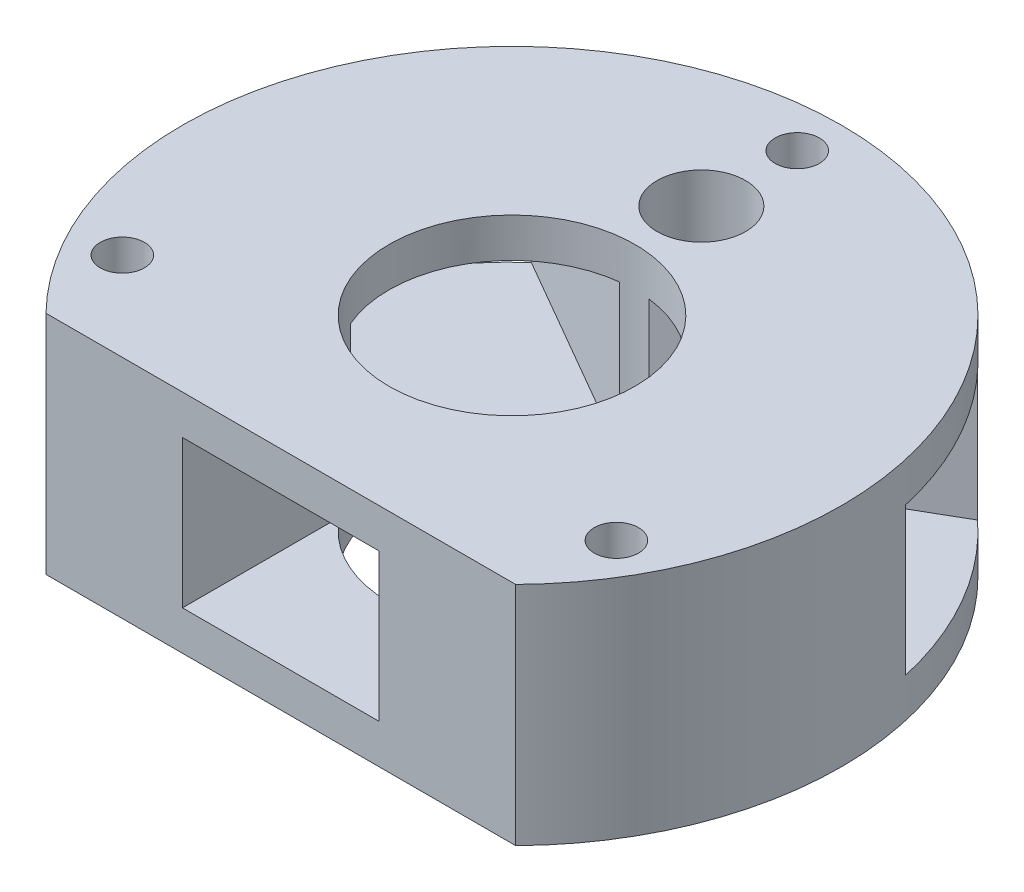
ISO-10303-21;
HEADER;
FILE_DESCRIPTION(('STEP AP214'),'2;1');
FILE_NAME('part.step','',(''),(''),'','','');
FILE_SCHEMA(('AUTOMOTIVE_DESIGN { 1 0 10303 214 1 1 1 1 }'));
ENDSEC;
DATA;
#1=APPLICATION_CONTEXT('core data for automotive mechanical design processes');
#2=APPLICATION_PROTOCOL_DEFINITION('international standard','automotive_design',2000,#1);
#3=PRODUCT_CONTEXT('',#1,'mechanical');
#4=PRODUCT('Part','Part','',(#3));
#5=PRODUCT_RELATED_PRODUCT_CATEGORY('part','',(#4));
#6=PRODUCT_DEFINITION_FORMATION('','',#4);
#7=PRODUCT_DEFINITION_CONTEXT('part definition',#1,'design');
#8=PRODUCT_DEFINITION('design','',#6,#7);
#9=PRODUCT_DEFINITION_SHAPE('','',#8);
#10=(LENGTH_UNIT() NAMED_UNIT(*) SI_UNIT(.MILLI.,.METRE.));
#11=(NAMED_UNIT(*) PLANE_ANGLE_UNIT() SI_UNIT($,.RADIAN.));
#12=(NAMED_UNIT(*) SI_UNIT($,.STERADIAN.) SOLID_ANGLE_UNIT());
#13=UNCERTAINTY_MEASURE_WITH_UNIT(LENGTH_MEASURE(1.E-05),#10,'distance_accuracy_value','');
#14=(GEOMETRIC_REPRESENTATION_CONTEXT(3) GLOBAL_UNCERTAINTY_ASSIGNED_CONTEXT((#13)) GLOBAL_UNIT_ASSIGNED_CONTEXT((#10,
#11,#12)) REPRESENTATION_CONTEXT('',''));
#15=CARTESIAN_POINT('',(0.,0.,0.));
#16=DIRECTION('',(0.,0.,1.));
#17=DIRECTION('',(1.,0.,0.));
#18=AXIS2_PLACEMENT_3D('',#15,#16,#17);
#19=CARTESIAN_POINT('',(0.,23.,0.));
#20=DIRECTION('',(0.,-1.,0.));
#21=DIRECTION('',(0.,0.,-1.));
#22=AXIS2_PLACEMENT_3D('',#19,#20,#21);
#23=CYLINDRICAL_SURFACE('',#22,33.5);
#24=CARTESIAN_POINT('',(0.,23.,0.));
#25=DIRECTION('',(0.,1.,0.));
#26=DIRECTION('',(0.,0.,1.));
#27=AXIS2_PLACEMENT_3D('',#24,#25,#26);
#28=CIRCLE('',#27,33.5);
#29=CARTESIAN_POINT('',(23.8746727726266,23.,23.5));
#30=VERTEX_POINT('',#29);
#31=CARTESIAN_POINT('',(-23.8746727726266,23.,23.5));
#32=VERTEX_POINT('',#31);
#33=EDGE_CURVE('E151',#30,#32,#28,.T.);
#34=ORIENTED_EDGE('',*,*,#33,.F.);
#35=DIRECTION('',(0.,-1.,0.));
#36=VECTOR('',#35,1.);
#37=CARTESIAN_POINT('',(23.8746727726266,23.,23.5));
#38=LINE('',#37,#36);
#39=CARTESIAN_POINT('',(23.8746727726266,0.,23.5));
#40=VERTEX_POINT('',#39);
#41=EDGE_CURVE('E136',#30,#40,#38,.T.);
#42=ORIENTED_EDGE('',*,*,#41,.T.);
#43=CARTESIAN_POINT('',(0.,0.,0.));
#44=DIRECTION('',(0.,1.,0.));
#45=DIRECTION('',(0.,0.,1.));
#46=AXIS2_PLACEMENT_3D('',#43,#44,#45);
#47=CIRCLE('',#46,33.5);
#48=CARTESIAN_POINT('',(-23.8746727726266,0.,23.5));
#49=VERTEX_POINT('',#48);
#50=EDGE_CURVE('E155',#40,#49,#47,.T.);
#51=ORIENTED_EDGE('',*,*,#50,.T.);
#52=DIRECTION('',(0.,-1.,0.));
#53=VECTOR('',#52,1.);
#54=CARTESIAN_POINT('',(-23.8746727726266,23.,23.5));
#55=LINE('',#54,#53);
#56=EDGE_CURVE('E53',#49,#32,#55,.F.);
#57=ORIENTED_EDGE('',*,*,#56,.T.);
#58=EDGE_LOOP('',(#34,#42,#51,#57));
#59=FACE_BOUND('',#58,.T.);
#60=DIRECTION('',(0.,-1.,0.));
#61=VECTOR('',#60,1.);
#62=CARTESIAN_POINT('',(-32.6891224129622,23.,-7.32606824090348));
#63=LINE('',#62,#61);
#64=CARTESIAN_POINT('',(-32.6891224129622,19.,-7.32606824090348));
#65=VERTEX_POINT('',#64);
#66=CARTESIAN_POINT('',(-32.6891224129622,4.,-7.32606824090348));
#67=VERTEX_POINT('',#66);
#68=EDGE_CURVE('E208',#65,#67,#63,.T.);
#69=ORIENTED_EDGE('',*,*,#68,.T.);
#70=CARTESIAN_POINT('',(0.,4.,0.));
#71=DIRECTION('',(0.,-1.,0.));
#72=DIRECTION('',(0.,0.,-1.));
#73=AXIS2_PLACEMENT_3D('',#70,#71,#72);
#74=CIRCLE('',#73,33.5);
#75=CARTESIAN_POINT('',(-22.6891224129623,4.,-24.6465763165923));
#76=VERTEX_POINT('',#75);
#77=EDGE_CURVE('E229',#67,#76,#74,.T.);
#78=ORIENTED_EDGE('',*,*,#77,.T.);
#79=DIRECTION('',(0.,-1.,0.));
#80=VECTOR('',#79,1.);
#81=CARTESIAN_POINT('',(-22.6891224129623,23.,-24.6465763165923));
#82=LINE('',#81,#80);
#83=CARTESIAN_POINT('',(-22.6891224129623,19.,-24.6465763165923));
#84=VERTEX_POINT('',#83);
#85=EDGE_CURVE('E212',#84,#76,#82,.T.);
#86=ORIENTED_EDGE('',*,*,#85,.F.);
#87=CARTESIAN_POINT('',(0.,19.,0.));
#88=DIRECTION('',(0.,-1.,0.));
#89=DIRECTION('',(0.,0.,-1.));
#90=AXIS2_PLACEMENT_3D('',#87,#88,#89);
#91=CIRCLE('',#90,33.5);
#92=EDGE_CURVE('E225',#65,#84,#91,.T.);
#93=ORIENTED_EDGE('',*,*,#92,.F.);
#94=EDGE_LOOP('',(#69,#78,#86,#93));
#95=FACE_BOUND('',#94,.T.);
#96=CARTESIAN_POINT('',(22.689122412962,19.,-24.6465763165927));
#97=VERTEX_POINT('',#96);
#98=CARTESIAN_POINT('',(32.6891224129621,19.,-7.32606824090393));
#99=VERTEX_POINT('',#98);
#100=EDGE_CURVE('E226',#97,#99,#91,.T.);
#101=ORIENTED_EDGE('',*,*,#100,.F.);
#102=DIRECTION('',(0.,-1.,0.));
#103=VECTOR('',#102,1.);
#104=CARTESIAN_POINT('',(22.689122412962,23.,-24.6465763165927));
#105=LINE('',#104,#103);
#106=CARTESIAN_POINT('',(22.689122412962,4.,-24.6465763165927));
#107=VERTEX_POINT('',#106);
#108=EDGE_CURVE('E232',#97,#107,#105,.T.);
#109=ORIENTED_EDGE('',*,*,#108,.T.);
#110=CARTESIAN_POINT('',(32.6891224129621,4.,-7.32606824090393));
#111=VERTEX_POINT('',#110);
#112=EDGE_CURVE('E230',#107,#111,#74,.T.);
#113=ORIENTED_EDGE('',*,*,#112,.T.);
#114=DIRECTION('',(0.,-1.,0.));
#115=VECTOR('',#114,1.);
#116=CARTESIAN_POINT('',(32.6891224129621,23.,-7.32606824090393));
#117=LINE('',#116,#115);
#118=EDGE_CURVE('E207',#99,#111,#117,.T.);
#119=ORIENTED_EDGE('',*,*,#118,.F.);
#120=EDGE_LOOP('',(#101,#109,#113,#119));
#121=FACE_BOUND('',#120,.T.);
#122=ADVANCED_FACE('F39',(#59,#95,#121),#23,.T.);
#123=CARTESIAN_POINT('',(0.,23.,0.));
#124=DIRECTION('',(0.,1.,0.));
#125=DIRECTION('',(0.,0.,1.));
#126=AXIS2_PLACEMENT_3D('',#123,#124,#125);
#127=CYLINDRICAL_SURFACE('',#126,12.5);
#128=CARTESIAN_POINT('',(0.,4.,0.));
#129=DIRECTION('',(0.,-1.,0.));
#130=DIRECTION('',(0.,0.,-1.));
#131=AXIS2_PLACEMENT_3D('',#128,#129,#130);
#132=CIRCLE('',#131,12.5);
#133=CARTESIAN_POINT('',(11.4951905283833,4.,4.91025403784433));
#134=VERTEX_POINT('',#133);
#135=CARTESIAN_POINT('',(1.49519052838325,4.,-12.4102540378444));
#136=VERTEX_POINT('',#135);
#137=EDGE_CURVE('E183',#134,#136,#132,.F.);
#138=ORIENTED_EDGE('',*,*,#137,.T.);
#139=DIRECTION('',(0.,1.,0.));
#140=VECTOR('',#139,1.);
#141=CARTESIAN_POINT('',(1.49519052838324,23.,-12.4102540378444));
#142=LINE('',#141,#140);
#143=CARTESIAN_POINT('',(1.49519052838325,19.,-12.4102540378444));
#144=VERTEX_POINT('',#143);
#145=EDGE_CURVE('E46',#136,#144,#142,.T.);
#146=ORIENTED_EDGE('',*,*,#145,.T.);
#147=CARTESIAN_POINT('',(0.,19.,0.));
#148=DIRECTION('',(0.,-1.,0.));
#149=DIRECTION('',(0.,0.,-1.));
#150=AXIS2_PLACEMENT_3D('',#147,#148,#149);
#151=CIRCLE('',#150,12.5);
#152=CARTESIAN_POINT('',(11.4951905283833,19.,4.91025403784432));
#153=VERTEX_POINT('',#152);
#154=EDGE_CURVE('E179',#153,#144,#151,.F.);
#155=ORIENTED_EDGE('',*,*,#154,.F.);
#156=DIRECTION('',(0.,1.,0.));
#157=VECTOR('',#156,1.);
#158=CARTESIAN_POINT('',(11.4951905283833,23.,4.91025403784433));
#159=LINE('',#158,#157);
#160=EDGE_CURVE('E185',#134,#153,#159,.T.);
#161=ORIENTED_EDGE('',*,*,#160,.F.);
#162=EDGE_LOOP('',(#138,#146,#155,#161));
#163=FACE_BOUND('',#162,.T.);
#164=CARTESIAN_POINT('',(0.,23.,0.));
#165=DIRECTION('',(0.,1.,0.));
#166=DIRECTION('',(0.,0.,1.));
#167=AXIS2_PLACEMENT_3D('',#164,#165,#166);
#168=CIRCLE('',#167,12.5);
#169=CARTESIAN_POINT('',(0.,23.,12.5));
#170=VERTEX_POINT('',#169);
#171=EDGE_CURVE('E239',#170,#170,#168,.T.);
#172=ORIENTED_EDGE('',*,*,#171,.T.);
#173=EDGE_LOOP('',(#172));
#174=FACE_BOUND('',#173,.T.);
#175=CARTESIAN_POINT('',(0.,0.,0.));
#176=DIRECTION('',(0.,1.,0.));
#177=DIRECTION('',(0.,0.,1.));
#178=AXIS2_PLACEMENT_3D('',#175,#176,#177);
#179=CIRCLE('',#178,12.5);
#180=CARTESIAN_POINT('',(0.,0.,12.5));
#181=VERTEX_POINT('',#180);
#182=EDGE_CURVE('E250',#181,#181,#179,.T.);
#183=ORIENTED_EDGE('',*,*,#182,.F.);
#184=EDGE_LOOP('',(#183));
#185=FACE_BOUND('',#184,.T.);
#186=DIRECTION('',(0.,1.,0.));
#187=VECTOR('',#186,1.);
#188=CARTESIAN_POINT('',(-10.,23.,7.50000000000002));
#189=LINE('',#188,#187);
#190=CARTESIAN_POINT('',(-10.,4.,7.50000000000002));
#191=VERTEX_POINT('',#190);
#192=CARTESIAN_POINT('',(-10.,19.,7.50000000000002));
#193=VERTEX_POINT('',#192);
#194=EDGE_CURVE('E167',#191,#193,#189,.T.);
#195=ORIENTED_EDGE('',*,*,#194,.F.);
#196=CARTESIAN_POINT('',(0.,4.,0.));
#197=DIRECTION('',(0.,-1.,0.));
#198=DIRECTION('',(0.,0.,-1.));
#199=AXIS2_PLACEMENT_3D('',#196,#197,#198);
#200=CIRCLE('',#199,12.5);
#201=CARTESIAN_POINT('',(10.,4.,7.50000000000002));
#202=VERTEX_POINT('',#201);
#203=EDGE_CURVE('E169',#191,#202,#200,.F.);
#204=ORIENTED_EDGE('',*,*,#203,.T.);
#205=DIRECTION('',(0.,1.,0.));
#206=VECTOR('',#205,1.);
#207=CARTESIAN_POINT('',(10.,23.,7.50000000000002));
#208=LINE('',#207,#206);
#209=CARTESIAN_POINT('',(10.,19.,7.50000000000002));
#210=VERTEX_POINT('',#209);
#211=EDGE_CURVE('E154',#202,#210,#208,.T.);
#212=ORIENTED_EDGE('',*,*,#211,.T.);
#213=CARTESIAN_POINT('',(0.,19.,0.));
#214=DIRECTION('',(0.,-1.,0.));
#215=DIRECTION('',(0.,0.,-1.));
#216=AXIS2_PLACEMENT_3D('',#213,#214,#215);
#217=CIRCLE('',#216,12.5);
#218=EDGE_CURVE('E158',#193,#210,#217,.F.);
#219=ORIENTED_EDGE('',*,*,#218,.F.);
#220=EDGE_LOOP('',(#195,#204,#212,#219));
#221=FACE_BOUND('',#220,.T.);
#222=DIRECTION('',(0.,1.,0.));
#223=VECTOR('',#222,1.);
#224=CARTESIAN_POINT('',(-1.49519052838342,23.,-12.4102540378444));
#225=LINE('',#224,#223);
#226=CARTESIAN_POINT('',(-1.49519052838342,4.,-12.4102540378444));
#227=VERTEX_POINT('',#226);
#228=CARTESIAN_POINT('',(-1.49519052838342,19.,-12.4102540378444));
#229=VERTEX_POINT('',#228);
#230=EDGE_CURVE('E182',#227,#229,#225,.T.);
#231=ORIENTED_EDGE('',*,*,#230,.F.);
#232=CARTESIAN_POINT('',(-11.4951905283833,4.,4.91025403784449));
#233=VERTEX_POINT('',#232);
#234=EDGE_CURVE('E178',#227,#233,#132,.F.);
#235=ORIENTED_EDGE('',*,*,#234,.T.);
#236=DIRECTION('',(0.,1.,0.));
#237=VECTOR('',#236,1.);
#238=CARTESIAN_POINT('',(-11.4951905283833,23.,4.91025403784449));
#239=LINE('',#238,#237);
#240=CARTESIAN_POINT('',(-11.4951905283833,19.,4.91025403784449));
#241=VERTEX_POINT('',#240);
#242=EDGE_CURVE('E172',#233,#241,#239,.T.);
#243=ORIENTED_EDGE('',*,*,#242,.T.);
#244=EDGE_CURVE('E175',#229,#241,#151,.F.);
#245=ORIENTED_EDGE('',*,*,#244,.F.);
#246=EDGE_LOOP('',(#231,#235,#243,#245));
#247=FACE_BOUND('',#246,.T.);
#248=ADVANCED_FACE('F192',(#163,#174,#185,#221,#247),#127,.F.);
#249=CARTESIAN_POINT('',(0.,23.,0.));
#250=DIRECTION('',(0.,1.,0.));
#251=DIRECTION('',(0.,0.,1.));
#252=AXIS2_PLACEMENT_3D('',#249,#250,#251);
#253=PLANE('',#252);
#254=DIRECTION('',(-1.,0.,0.));
#255=VECTOR('',#254,1.);
#256=CARTESIAN_POINT('',(-33.5,23.,23.5));
#257=LINE('',#256,#255);
#258=EDGE_CURVE('E139',#30,#32,#257,.T.);
#259=ORIENTED_EDGE('',*,*,#258,.F.);
#260=ORIENTED_EDGE('',*,*,#33,.T.);
#261=EDGE_LOOP('',(#259,#260));
#262=FACE_BOUND('',#261,.T.);
#263=ORIENTED_EDGE('',*,*,#171,.F.);
#264=EDGE_LOOP('',(#263));
#265=FACE_BOUND('',#264,.T.);
#266=CARTESIAN_POINT('',(0.,23.,-19.25));
#267=DIRECTION('',(0.,1.,0.));
#268=DIRECTION('',(0.,0.,1.));
#269=AXIS2_PLACEMENT_3D('',#266,#267,#268);
#270=CIRCLE('',#269,4.50000000000001);
#271=CARTESIAN_POINT('',(0.,23.,-14.75));
#272=VERTEX_POINT('',#271);
#273=EDGE_CURVE('E253',#272,#272,#270,.T.);
#274=ORIENTED_EDGE('',*,*,#273,.F.);
#275=EDGE_LOOP('',(#274));
#276=FACE_BOUND('',#275,.T.);
#277=CARTESIAN_POINT('',(0.,23.,-29.));
#278=DIRECTION('',(0.,1.,0.));
#279=DIRECTION('',(0.,0.,1.));
#280=AXIS2_PLACEMENT_3D('',#277,#278,#279);
#281=CIRCLE('',#280,2.25000000000001);
#282=CARTESIAN_POINT('',(0.,23.,-26.75));
#283=VERTEX_POINT('',#282);
#284=EDGE_CURVE('E259',#283,#283,#281,.T.);
#285=ORIENTED_EDGE('',*,*,#284,.F.);
#286=EDGE_LOOP('',(#285));
#287=FACE_BOUND('',#286,.T.);
#288=CARTESIAN_POINT('',(-25.1147367097487,23.,14.5000000000001));
#289=DIRECTION('',(0.,1.,0.));
#290=DIRECTION('',(0.,0.,1.));
#291=AXIS2_PLACEMENT_3D('',#288,#289,#290);
#292=CIRCLE('',#291,2.25000000000001);
#293=CARTESIAN_POINT('',(-25.1147367097487,23.,16.7500000000001));
#294=VERTEX_POINT('',#293);
#295=EDGE_CURVE('E265',#294,#294,#292,.T.);
#296=ORIENTED_EDGE('',*,*,#295,.F.);
#297=EDGE_LOOP('',(#296));
#298=FACE_BOUND('',#297,.T.);
#299=CARTESIAN_POINT('',(25.1147367097487,23.,14.5000000000001));
#300=DIRECTION('',(0.,1.,0.));
#301=DIRECTION('',(0.,0.,1.));
#302=AXIS2_PLACEMENT_3D('',#299,#300,#301);
#303=CIRCLE('',#302,2.25000000000001);
#304=CARTESIAN_POINT('',(25.1147367097487,23.,16.7500000000001));
#305=VERTEX_POINT('',#304);
#306=EDGE_CURVE('E270',#305,#305,#303,.T.);
#307=ORIENTED_EDGE('',*,*,#306,.F.);
#308=EDGE_LOOP('',(#307));
#309=FACE_BOUND('',#308,.T.);
#310=ADVANCED_FACE('F149',(#262,#265,#276,#287,#298,#309),#253,.T.);
#311=CARTESIAN_POINT('',(0.,0.,0.));
#312=DIRECTION('',(0.,1.,0.));
#313=DIRECTION('',(0.,0.,1.));
#314=AXIS2_PLACEMENT_3D('',#311,#312,#313);
#315=PLANE('',#314);
#316=ORIENTED_EDGE('',*,*,#182,.T.);
#317=EDGE_LOOP('',(#316));
#318=FACE_BOUND('',#317,.T.);
#319=CARTESIAN_POINT('',(0.,0.,-19.25));
#320=DIRECTION('',(0.,1.,0.));
#321=DIRECTION('',(0.,0.,1.));
#322=AXIS2_PLACEMENT_3D('',#319,#320,#321);
#323=CIRCLE('',#322,4.50000000000001);
#324=CARTESIAN_POINT('',(0.,0.,-14.75));
#325=VERTEX_POINT('',#324);
#326=EDGE_CURVE('E256',#325,#325,#323,.T.);
#327=ORIENTED_EDGE('',*,*,#326,.T.);
#328=EDGE_LOOP('',(#327));
#329=FACE_BOUND('',#328,.T.);
#330=CARTESIAN_POINT('',(0.,0.,-29.));
#331=DIRECTION('',(0.,1.,0.));
#332=DIRECTION('',(0.,0.,1.));
#333=AXIS2_PLACEMENT_3D('',#330,#331,#332);
#334=CIRCLE('',#333,2.25000000000001);
#335=CARTESIAN_POINT('',(0.,0.,-26.75));
#336=VERTEX_POINT('',#335);
#337=EDGE_CURVE('E262',#336,#336,#334,.T.);
#338=ORIENTED_EDGE('',*,*,#337,.T.);
#339=EDGE_LOOP('',(#338));
#340=FACE_BOUND('',#339,.T.);
#341=CARTESIAN_POINT('',(-25.1147367097487,0.,14.5000000000001));
#342=DIRECTION('',(0.,1.,0.));
#343=DIRECTION('',(0.,0.,1.));
#344=AXIS2_PLACEMENT_3D('',#341,#342,#343);
#345=CIRCLE('',#344,2.25000000000001);
#346=CARTESIAN_POINT('',(-25.1147367097487,0.,16.7500000000001));
#347=VERTEX_POINT('',#346);
#348=EDGE_CURVE('E268',#347,#347,#345,.T.);
#349=ORIENTED_EDGE('',*,*,#348,.T.);
#350=EDGE_LOOP('',(#349));
#351=FACE_BOUND('',#350,.T.);
#352=CARTESIAN_POINT('',(25.1147367097487,0.,14.5000000000001));
#353=DIRECTION('',(0.,1.,0.));
#354=DIRECTION('',(0.,0.,1.));
#355=AXIS2_PLACEMENT_3D('',#352,#353,#354);
#356=CIRCLE('',#355,2.25000000000001);
#357=CARTESIAN_POINT('',(25.1147367097487,0.,16.7500000000001));
#358=VERTEX_POINT('',#357);
#359=EDGE_CURVE('E160',#358,#358,#356,.T.);
#360=ORIENTED_EDGE('',*,*,#359,.T.);
#361=EDGE_LOOP('',(#360));
#362=FACE_BOUND('',#361,.T.);
#363=ORIENTED_EDGE('',*,*,#50,.F.);
#364=DIRECTION('',(1.,0.,0.));
#365=VECTOR('',#364,1.);
#366=CARTESIAN_POINT('',(-33.5,0.,23.5));
#367=LINE('',#366,#365);
#368=EDGE_CURVE('E140',#49,#40,#367,.T.);
#369=ORIENTED_EDGE('',*,*,#368,.F.);
#370=EDGE_LOOP('',(#363,#369));
#371=FACE_BOUND('',#370,.T.);
#372=ADVANCED_FACE('F277',(#318,#329,#340,#351,#362,#371),#315,.F.);
#373=CARTESIAN_POINT('',(25.1147367097487,23.,14.5000000000001));
#374=DIRECTION('',(0.,1.,0.));
#375=DIRECTION('',(0.,0.,1.));
#376=AXIS2_PLACEMENT_3D('',#373,#374,#375);
#377=CYLINDRICAL_SURFACE('',#376,2.25000000000001);
#378=ORIENTED_EDGE('',*,*,#359,.F.);
#379=EDGE_LOOP('',(#378));
#380=FACE_BOUND('',#379,.T.);
#381=ORIENTED_EDGE('',*,*,#306,.T.);
#382=EDGE_LOOP('',(#381));
#383=FACE_BOUND('',#382,.T.);
#384=ADVANCED_FACE('F280',(#380,#383),#377,.F.);
#385=CARTESIAN_POINT('',(-25.1147367097487,23.,14.5000000000001));
#386=DIRECTION('',(0.,1.,0.));
#387=DIRECTION('',(0.,0.,1.));
#388=AXIS2_PLACEMENT_3D('',#385,#386,#387);
#389=CYLINDRICAL_SURFACE('',#388,2.25000000000001);
#390=ORIENTED_EDGE('',*,*,#348,.F.);
#391=EDGE_LOOP('',(#390));
#392=FACE_BOUND('',#391,.T.);
#393=ORIENTED_EDGE('',*,*,#295,.T.);
#394=EDGE_LOOP('',(#393));
#395=FACE_BOUND('',#394,.T.);
#396=ADVANCED_FACE('F282',(#392,#395),#389,.F.);
#397=CARTESIAN_POINT('',(0.,23.,-29.));
#398=DIRECTION('',(0.,1.,0.));
#399=DIRECTION('',(0.,0.,1.));
#400=AXIS2_PLACEMENT_3D('',#397,#398,#399);
#401=CYLINDRICAL_SURFACE('',#400,2.25000000000001);
#402=ORIENTED_EDGE('',*,*,#337,.F.);
#403=EDGE_LOOP('',(#402));
#404=FACE_BOUND('',#403,.T.);
#405=ORIENTED_EDGE('',*,*,#284,.T.);
#406=EDGE_LOOP('',(#405));
#407=FACE_BOUND('',#406,.T.);
#408=ADVANCED_FACE('F287',(#404,#407),#401,.F.);
#409=CARTESIAN_POINT('',(0.,23.,-19.25));
#410=DIRECTION('',(0.,1.,0.));
#411=DIRECTION('',(0.,0.,1.));
#412=AXIS2_PLACEMENT_3D('',#409,#410,#411);
#413=CYLINDRICAL_SURFACE('',#412,4.50000000000001);
#414=ORIENTED_EDGE('',*,*,#326,.F.);
#415=EDGE_LOOP('',(#414));
#416=FACE_BOUND('',#415,.T.);
#417=ORIENTED_EDGE('',*,*,#273,.T.);
#418=EDGE_LOOP('',(#417));
#419=FACE_BOUND('',#418,.T.);
#420=ADVANCED_FACE('F308',(#416,#419),#413,.F.);
#421=CARTESIAN_POINT('',(0.,4.,3.5));
#422=DIRECTION('',(0.,-1.,0.));
#423=DIRECTION('',(0.,0.,-1.));
#424=AXIS2_PLACEMENT_3D('',#421,#422,#423);
#425=PLANE('',#424);
#426=DIRECTION('',(0.,0.,1.));
#427=VECTOR('',#426,1.);
#428=CARTESIAN_POINT('',(-10.,4.,3.5));
#429=LINE('',#428,#427);
#430=CARTESIAN_POINT('',(-10.,4.,23.5));
#431=VERTEX_POINT('',#430);
#432=EDGE_CURVE('E236',#191,#431,#429,.T.);
#433=ORIENTED_EDGE('',*,*,#432,.T.);
#434=DIRECTION('',(1.,0.,0.));
#435=VECTOR('',#434,1.);
#436=CARTESIAN_POINT('',(0.,4.,23.5));
#437=LINE('',#436,#435);
#438=CARTESIAN_POINT('',(10.,4.,23.5));
#439=VERTEX_POINT('',#438);
#440=EDGE_CURVE('E477',#431,#439,#437,.T.);
#441=ORIENTED_EDGE('',*,*,#440,.T.);
#442=DIRECTION('',(0.,0.,1.));
#443=VECTOR('',#442,1.);
#444=CARTESIAN_POINT('',(10.,4.,3.5));
#445=LINE('',#444,#443);
#446=EDGE_CURVE('E235',#202,#439,#445,.T.);
#447=ORIENTED_EDGE('',*,*,#446,.F.);
#448=ORIENTED_EDGE('',*,*,#203,.F.);
#449=EDGE_LOOP('',(#433,#441,#447,#448));
#450=FACE_BOUND('',#449,.T.);
#451=ADVANCED_FACE('F306',(#450),#425,.F.);
#452=CARTESIAN_POINT('',(-10.,0.,3.5));
#453=DIRECTION('',(1.,0.,0.));
#454=DIRECTION('',(0.,0.,-1.));
#455=AXIS2_PLACEMENT_3D('',#452,#453,#454);
#456=PLANE('',#455);
#457=DIRECTION('',(0.,1.,0.));
#458=VECTOR('',#457,1.);
#459=CARTESIAN_POINT('',(-10.,0.,23.5));
#460=LINE('',#459,#458);
#461=CARTESIAN_POINT('',(-10.,19.,23.5));
#462=VERTEX_POINT('',#461);
#463=EDGE_CURVE('E475',#431,#462,#460,.T.);
#464=ORIENTED_EDGE('',*,*,#463,.F.);
#465=ORIENTED_EDGE('',*,*,#432,.F.);
#466=ORIENTED_EDGE('',*,*,#194,.T.);
#467=DIRECTION('',(0.,0.,1.));
#468=VECTOR('',#467,1.);
#469=CARTESIAN_POINT('',(-10.,19.,3.5));
#470=LINE('',#469,#468);
#471=EDGE_CURVE('E240',#193,#462,#470,.T.);
#472=ORIENTED_EDGE('',*,*,#471,.T.);
#473=EDGE_LOOP('',(#464,#465,#466,#472));
#474=FACE_BOUND('',#473,.T.);
#475=ADVANCED_FACE('F343',(#474),#456,.T.);
#476=CARTESIAN_POINT('',(0.,19.,3.5));
#477=DIRECTION('',(0.,-1.,0.));
#478=DIRECTION('',(0.,0.,-1.));
#479=AXIS2_PLACEMENT_3D('',#476,#477,#478);
#480=PLANE('',#479);
#481=DIRECTION('',(1.,0.,0.));
#482=VECTOR('',#481,1.);
#483=CARTESIAN_POINT('',(0.,19.,23.5));
#484=LINE('',#483,#482);
#485=CARTESIAN_POINT('',(10.,19.,23.5));
#486=VERTEX_POINT('',#485);
#487=EDGE_CURVE('E61',#462,#486,#484,.T.);
#488=ORIENTED_EDGE('',*,*,#487,.F.);
#489=ORIENTED_EDGE('',*,*,#471,.F.);
#490=ORIENTED_EDGE('',*,*,#218,.T.);
#491=DIRECTION('',(0.,0.,1.));
#492=VECTOR('',#491,1.);
#493=CARTESIAN_POINT('',(10.,19.,3.5));
#494=LINE('',#493,#492);
#495=EDGE_CURVE('E243',#210,#486,#494,.T.);
#496=ORIENTED_EDGE('',*,*,#495,.T.);
#497=EDGE_LOOP('',(#488,#489,#490,#496));
#498=FACE_BOUND('',#497,.T.);
#499=ADVANCED_FACE('F352',(#498),#480,.T.);
#500=CARTESIAN_POINT('',(10.,0.,3.5));
#501=DIRECTION('',(1.,0.,0.));
#502=DIRECTION('',(0.,0.,-1.));
#503=AXIS2_PLACEMENT_3D('',#500,#501,#502);
#504=PLANE('',#503);
#505=ORIENTED_EDGE('',*,*,#446,.T.);
#506=DIRECTION('',(0.,1.,0.));
#507=VECTOR('',#506,1.);
#508=CARTESIAN_POINT('',(10.,0.,23.5));
#509=LINE('',#508,#507);
#510=EDGE_CURVE('E11',#439,#486,#509,.T.);
#511=ORIENTED_EDGE('',*,*,#510,.T.);
#512=ORIENTED_EDGE('',*,*,#495,.F.);
#513=ORIENTED_EDGE('',*,*,#211,.F.);
#514=EDGE_LOOP('',(#505,#511,#512,#513));
#515=FACE_BOUND('',#514,.T.);
#516=ADVANCED_FACE('F362',(#515),#504,.F.);
#517=CARTESIAN_POINT('',(1.96891108675436,0.,-10.4102540378444));
#518=DIRECTION('',(-0.499999999999992,0.,0.866025403784443));
#519=DIRECTION('',(0.866025403784443,0.,0.499999999999992));
#520=AXIS2_PLACEMENT_3D('',#517,#518,#519);
#521=PLANE('',#520);
#522=ORIENTED_EDGE('',*,*,#85,.T.);
#523=DIRECTION('',(-0.866025403784443,0.,-0.499999999999992));
#524=VECTOR('',#523,1.);
#525=CARTESIAN_POINT('',(1.96891108675436,4.,-10.4102540378444));
#526=LINE('',#525,#524);
#527=EDGE_CURVE('E221',#227,#76,#526,.T.);
#528=ORIENTED_EDGE('',*,*,#527,.F.);
#529=ORIENTED_EDGE('',*,*,#230,.T.);
#530=DIRECTION('',(-0.866025403784443,0.,-0.499999999999992));
#531=VECTOR('',#530,1.);
#532=CARTESIAN_POINT('',(1.96891108675436,19.,-10.4102540378444));
#533=LINE('',#532,#531);
#534=EDGE_CURVE('E492',#229,#84,#533,.T.);
#535=ORIENTED_EDGE('',*,*,#534,.T.);
#536=EDGE_LOOP('',(#522,#528,#529,#535));
#537=FACE_BOUND('',#536,.T.);
#538=ADVANCED_FACE('F372',(#537),#521,.T.);
#539=CARTESIAN_POINT('',(-8.03108891324547,0.,6.91025403784446));
#540=DIRECTION('',(-0.499999999999992,0.,0.866025403784443));
#541=DIRECTION('',(0.866025403784443,0.,0.499999999999992));
#542=AXIS2_PLACEMENT_3D('',#539,#540,#541);
#543=PLANE('',#542);
#544=DIRECTION('',(-0.866025403784443,0.,-0.499999999999992));
#545=VECTOR('',#544,1.);
#546=CARTESIAN_POINT('',(-8.03108891324547,19.,6.91025403784446));
#547=LINE('',#546,#545);
#548=EDGE_CURVE('E494',#241,#65,#547,.T.);
#549=ORIENTED_EDGE('',*,*,#548,.F.);
#550=ORIENTED_EDGE('',*,*,#242,.F.);
#551=DIRECTION('',(-0.866025403784443,0.,-0.499999999999992));
#552=VECTOR('',#551,1.);
#553=CARTESIAN_POINT('',(-8.03108891324547,4.,6.91025403784446));
#554=LINE('',#553,#552);
#555=EDGE_CURVE('E145',#233,#67,#554,.T.);
#556=ORIENTED_EDGE('',*,*,#555,.T.);
#557=ORIENTED_EDGE('',*,*,#68,.F.);
#558=EDGE_LOOP('',(#549,#550,#556,#557));
#559=FACE_BOUND('',#558,.T.);
#560=ADVANCED_FACE('F389',(#559),#543,.F.);
#561=CARTESIAN_POINT('',(3.03108891324554,19.,-1.75000000000002));
#562=DIRECTION('',(0.,-1.,0.));
#563=DIRECTION('',(0.,0.,-1.));
#564=AXIS2_PLACEMENT_3D('',#561,#562,#563);
#565=PLANE('',#564);
#566=ORIENTED_EDGE('',*,*,#92,.T.);
#567=ORIENTED_EDGE('',*,*,#534,.F.);
#568=ORIENTED_EDGE('',*,*,#244,.T.);
#569=ORIENTED_EDGE('',*,*,#548,.T.);
#570=EDGE_LOOP('',(#566,#567,#568,#569));
#571=FACE_BOUND('',#570,.T.);
#572=ADVANCED_FACE('F399',(#571),#565,.T.);
#573=CARTESIAN_POINT('',(3.03108891324554,4.,-1.75000000000002));
#574=DIRECTION('',(0.,-1.,0.));
#575=DIRECTION('',(0.,0.,-1.));
#576=AXIS2_PLACEMENT_3D('',#573,#574,#575);
#577=PLANE('',#576);
#578=ORIENTED_EDGE('',*,*,#555,.F.);
#579=ORIENTED_EDGE('',*,*,#234,.F.);
#580=ORIENTED_EDGE('',*,*,#527,.T.);
#581=ORIENTED_EDGE('',*,*,#77,.F.);
#582=EDGE_LOOP('',(#578,#579,#580,#581));
#583=FACE_BOUND('',#582,.T.);
#584=ADVANCED_FACE('F409',(#583),#577,.F.);
#585=CARTESIAN_POINT('',(-1.96891108675451,0.,-10.4102540378444));
#586=DIRECTION('',(-0.500000000000004,0.,-0.866025403784436));
#587=DIRECTION('',(-0.866025403784436,0.,0.500000000000004));
#588=AXIS2_PLACEMENT_3D('',#585,#586,#587);
#589=PLANE('',#588);
#590=DIRECTION('',(0.866025403784436,0.,-0.500000000000004));
#591=VECTOR('',#590,1.);
#592=CARTESIAN_POINT('',(-1.96891108675451,19.,-10.4102540378444));
#593=LINE('',#592,#591);
#594=EDGE_CURVE('E214',#144,#97,#593,.T.);
#595=ORIENTED_EDGE('',*,*,#594,.F.);
#596=ORIENTED_EDGE('',*,*,#145,.F.);
#597=DIRECTION('',(0.866025403784436,0.,-0.500000000000004));
#598=VECTOR('',#597,1.);
#599=CARTESIAN_POINT('',(-1.96891108675451,4.,-10.4102540378444));
#600=LINE('',#599,#598);
#601=EDGE_CURVE('E201',#136,#107,#600,.T.);
#602=ORIENTED_EDGE('',*,*,#601,.T.);
#603=ORIENTED_EDGE('',*,*,#108,.F.);
#604=EDGE_LOOP('',(#595,#596,#602,#603));
#605=FACE_BOUND('',#604,.T.);
#606=ADVANCED_FACE('F423',(#605),#589,.F.);
#607=ORIENTED_EDGE('',*,*,#601,.F.);
#608=ORIENTED_EDGE('',*,*,#137,.F.);
#609=DIRECTION('',(0.866025403784436,0.,-0.500000000000004));
#610=VECTOR('',#609,1.);
#611=CARTESIAN_POINT('',(8.03108891324558,4.,6.91025403784434));
#612=LINE('',#611,#610);
#613=EDGE_CURVE('E199',#134,#111,#612,.T.);
#614=ORIENTED_EDGE('',*,*,#613,.T.);
#615=ORIENTED_EDGE('',*,*,#112,.F.);
#616=EDGE_LOOP('',(#607,#608,#614,#615));
#617=FACE_BOUND('',#616,.T.);
#618=ADVANCED_FACE('F198',(#617),#577,.F.);
#619=CARTESIAN_POINT('',(8.03108891324558,0.,6.91025403784434));
#620=DIRECTION('',(-0.500000000000004,0.,-0.866025403784436));
#621=DIRECTION('',(-0.866025403784436,0.,0.500000000000004));
#622=AXIS2_PLACEMENT_3D('',#619,#620,#621);
#623=PLANE('',#622);
#624=ORIENTED_EDGE('',*,*,#118,.T.);
#625=ORIENTED_EDGE('',*,*,#613,.F.);
#626=ORIENTED_EDGE('',*,*,#160,.T.);
#627=DIRECTION('',(0.866025403784436,0.,-0.500000000000004));
#628=VECTOR('',#627,1.);
#629=CARTESIAN_POINT('',(8.03108891324558,19.,6.91025403784434));
#630=LINE('',#629,#628);
#631=EDGE_CURVE('E209',#153,#99,#630,.T.);
#632=ORIENTED_EDGE('',*,*,#631,.T.);
#633=EDGE_LOOP('',(#624,#625,#626,#632));
#634=FACE_BOUND('',#633,.T.);
#635=ADVANCED_FACE('F204',(#634),#623,.T.);
#636=ORIENTED_EDGE('',*,*,#100,.T.);
#637=ORIENTED_EDGE('',*,*,#631,.F.);
#638=ORIENTED_EDGE('',*,*,#154,.T.);
#639=ORIENTED_EDGE('',*,*,#594,.T.);
#640=EDGE_LOOP('',(#636,#637,#638,#639));
#641=FACE_BOUND('',#640,.T.);
#642=ADVANCED_FACE('F412',(#641),#565,.T.);
#643=CARTESIAN_POINT('',(0.,0.,23.5));
#644=DIRECTION('',(0.,0.,-1.));
#645=DIRECTION('',(-1.,0.,0.));
#646=AXIS2_PLACEMENT_3D('',#643,#644,#645);
#647=PLANE('',#646);
#648=ORIENTED_EDGE('',*,*,#463,.T.);
#649=ORIENTED_EDGE('',*,*,#487,.T.);
#650=ORIENTED_EDGE('',*,*,#510,.F.);
#651=ORIENTED_EDGE('',*,*,#440,.F.);
#652=EDGE_LOOP('',(#648,#649,#650,#651));
#653=FACE_BOUND('',#652,.T.);
#654=ORIENTED_EDGE('',*,*,#258,.T.);
#655=ORIENTED_EDGE('',*,*,#56,.F.);
#656=ORIENTED_EDGE('',*,*,#368,.T.);
#657=ORIENTED_EDGE('',*,*,#41,.F.);
#658=EDGE_LOOP('',(#654,#655,#656,#657));
#659=FACE_BOUND('',#658,.T.);
#660=ADVANCED_FACE('F138',(#653,#659),#647,.F.);
#661=CLOSED_SHELL('',(#122,#248,#310,#372,#384,#396,#408,#420,#451,#475,#499,#516,#538,#560,
#572,#584,#606,#618,#635,#642,#660));
#662=MANIFOLD_SOLID_BREP('B2',#661);
#663=ADVANCED_BREP_SHAPE_REPRESENTATION('',(#18,#662),#14);
#664=SHAPE_DEFINITION_REPRESENTATION(#9,#663);
ENDSEC;
END-ISO-10303-21;
